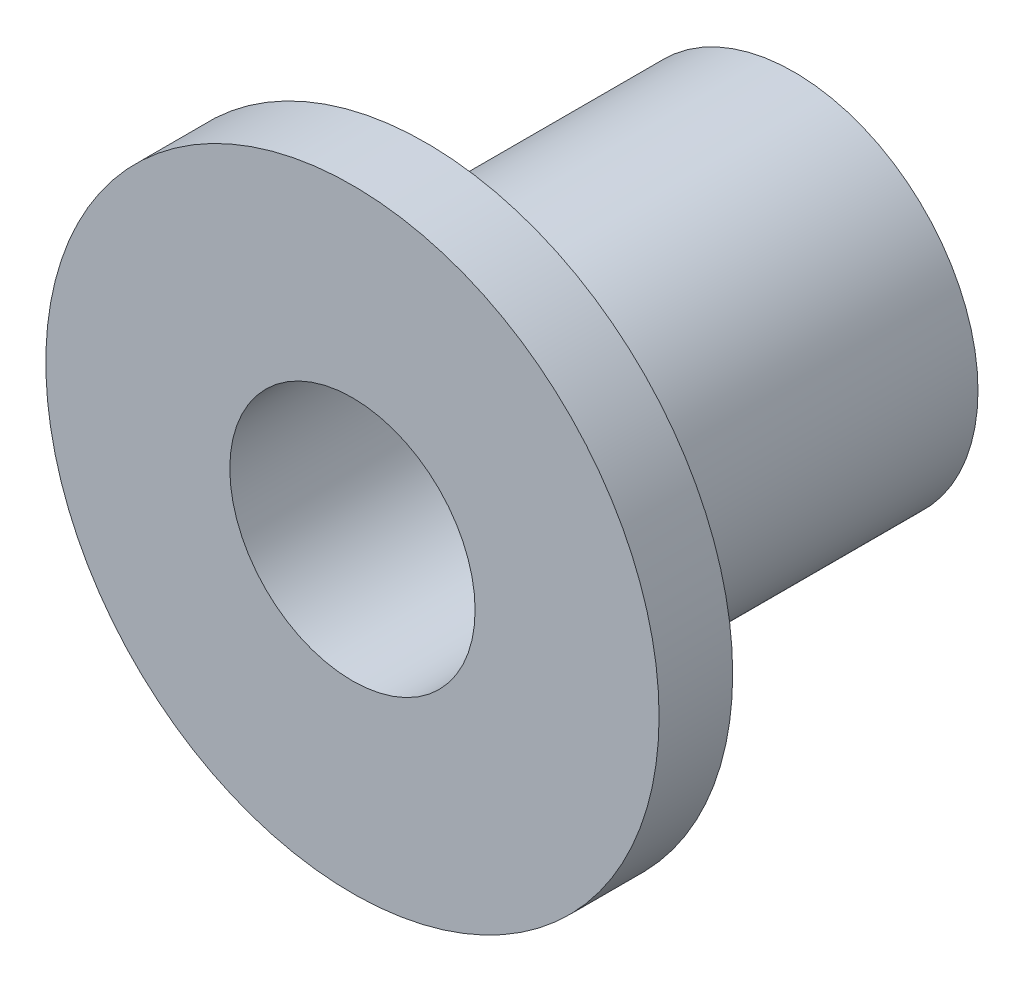
ISO-10303-21;
HEADER;
FILE_DESCRIPTION(('STEP AP214'),'2;1');
FILE_NAME('part.step','',(''),(''),'','','');
FILE_SCHEMA(('AUTOMOTIVE_DESIGN { 1 0 10303 214 1 1 1 1 }'));
ENDSEC;
DATA;
#1=APPLICATION_CONTEXT('core data for automotive mechanical design processes');
#2=APPLICATION_PROTOCOL_DEFINITION('international standard','automotive_design',2000,#1);
#3=PRODUCT_CONTEXT('',#1,'mechanical');
#4=PRODUCT('Part','Part','',(#3));
#5=PRODUCT_RELATED_PRODUCT_CATEGORY('part','',(#4));
#6=PRODUCT_DEFINITION_FORMATION('','',#4);
#7=PRODUCT_DEFINITION_CONTEXT('part definition',#1,'design');
#8=PRODUCT_DEFINITION('design','',#6,#7);
#9=PRODUCT_DEFINITION_SHAPE('','',#8);
#10=(LENGTH_UNIT() NAMED_UNIT(*) SI_UNIT(.MILLI.,.METRE.));
#11=(NAMED_UNIT(*) PLANE_ANGLE_UNIT() SI_UNIT($,.RADIAN.));
#12=(NAMED_UNIT(*) SI_UNIT($,.STERADIAN.) SOLID_ANGLE_UNIT());
#13=UNCERTAINTY_MEASURE_WITH_UNIT(LENGTH_MEASURE(1.E-05),#10,'distance_accuracy_value','');
#14=(GEOMETRIC_REPRESENTATION_CONTEXT(3) GLOBAL_UNCERTAINTY_ASSIGNED_CONTEXT((#13)) GLOBAL_UNIT_ASSIGNED_CONTEXT((#10,
#11,#12)) REPRESENTATION_CONTEXT('',''));
#15=CARTESIAN_POINT('',(0.,0.,0.));
#16=DIRECTION('',(0.,0.,1.));
#17=DIRECTION('',(1.,0.,0.));
#18=AXIS2_PLACEMENT_3D('',#15,#16,#17);
#19=CARTESIAN_POINT('',(0.,0.,3.));
#20=DIRECTION('',(0.,0.,-1.));
#21=DIRECTION('',(-1.,0.,0.));
#22=AXIS2_PLACEMENT_3D('',#19,#20,#21);
#23=CYLINDRICAL_SURFACE('',#22,12.5);
#24=CARTESIAN_POINT('',(0.,0.,3.));
#25=DIRECTION('',(0.,0.,1.));
#26=DIRECTION('',(1.,0.,0.));
#27=AXIS2_PLACEMENT_3D('',#24,#25,#26);
#28=CIRCLE('',#27,12.5);
#29=CARTESIAN_POINT('',(12.5,0.,3.));
#30=VERTEX_POINT('',#29);
#31=EDGE_CURVE('E38',#30,#30,#28,.T.);
#32=ORIENTED_EDGE('',*,*,#31,.F.);
#33=EDGE_LOOP('',(#32));
#34=FACE_BOUND('',#33,.T.);
#35=CARTESIAN_POINT('',(0.,0.,0.));
#36=DIRECTION('',(0.,0.,1.));
#37=DIRECTION('',(1.,0.,0.));
#38=AXIS2_PLACEMENT_3D('',#35,#36,#37);
#39=CIRCLE('',#38,12.5);
#40=CARTESIAN_POINT('',(12.5,0.,0.));
#41=VERTEX_POINT('',#40);
#42=EDGE_CURVE('E34',#41,#41,#39,.T.);
#43=ORIENTED_EDGE('',*,*,#42,.T.);
#44=EDGE_LOOP('',(#43));
#45=FACE_BOUND('',#44,.T.);
#46=ADVANCED_FACE('F31',(#34,#45),#23,.T.);
#47=CARTESIAN_POINT('',(0.,0.,3.));
#48=DIRECTION('',(0.,0.,-1.));
#49=DIRECTION('',(-1.,0.,0.));
#50=AXIS2_PLACEMENT_3D('',#47,#48,#49);
#51=CYLINDRICAL_SURFACE('',#50,5.);
#52=CARTESIAN_POINT('',(0.,0.,3.));
#53=DIRECTION('',(0.,0.,1.));
#54=DIRECTION('',(1.,0.,0.));
#55=AXIS2_PLACEMENT_3D('',#52,#53,#54);
#56=CIRCLE('',#55,5.);
#57=CARTESIAN_POINT('',(5.,0.,3.));
#58=VERTEX_POINT('',#57);
#59=EDGE_CURVE('E10',#58,#58,#56,.T.);
#60=ORIENTED_EDGE('',*,*,#59,.T.);
#61=EDGE_LOOP('',(#60));
#62=FACE_BOUND('',#61,.T.);
#63=CARTESIAN_POINT('',(0.,0.,-15.));
#64=DIRECTION('',(0.,0.,1.));
#65=DIRECTION('',(1.,0.,0.));
#66=AXIS2_PLACEMENT_3D('',#63,#64,#65);
#67=CIRCLE('',#66,5.);
#68=CARTESIAN_POINT('',(5.,0.,-15.));
#69=VERTEX_POINT('',#68);
#70=EDGE_CURVE('E47',#69,#69,#67,.T.);
#71=ORIENTED_EDGE('',*,*,#70,.F.);
#72=EDGE_LOOP('',(#71));
#73=FACE_BOUND('',#72,.T.);
#74=ADVANCED_FACE('F57',(#62,#73),#51,.F.);
#75=CARTESIAN_POINT('',(0.,0.,3.));
#76=DIRECTION('',(0.,0.,1.));
#77=DIRECTION('',(1.,0.,0.));
#78=AXIS2_PLACEMENT_3D('',#75,#76,#77);
#79=PLANE('',#78);
#80=ORIENTED_EDGE('',*,*,#31,.T.);
#81=EDGE_LOOP('',(#80));
#82=FACE_BOUND('',#81,.T.);
#83=ORIENTED_EDGE('',*,*,#59,.F.);
#84=EDGE_LOOP('',(#83));
#85=FACE_BOUND('',#84,.T.);
#86=ADVANCED_FACE('F59',(#82,#85),#79,.T.);
#87=CARTESIAN_POINT('',(0.,0.,0.));
#88=DIRECTION('',(0.,0.,1.));
#89=DIRECTION('',(1.,0.,0.));
#90=AXIS2_PLACEMENT_3D('',#87,#88,#89);
#91=PLANE('',#90);
#92=CARTESIAN_POINT('',(0.,0.,0.));
#93=DIRECTION('',(0.,0.,1.));
#94=DIRECTION('',(1.,0.,0.));
#95=AXIS2_PLACEMENT_3D('',#92,#93,#94);
#96=CIRCLE('',#95,7.5);
#97=CARTESIAN_POINT('',(7.5,0.,0.));
#98=VERTEX_POINT('',#97);
#99=EDGE_CURVE('E44',#98,#98,#96,.T.);
#100=ORIENTED_EDGE('',*,*,#99,.T.);
#101=EDGE_LOOP('',(#100));
#102=FACE_BOUND('',#101,.T.);
#103=ORIENTED_EDGE('',*,*,#42,.F.);
#104=EDGE_LOOP('',(#103));
#105=FACE_BOUND('',#104,.T.);
#106=ADVANCED_FACE('F64',(#102,#105),#91,.F.);
#107=CARTESIAN_POINT('',(0.,0.,-15.));
#108=DIRECTION('',(0.,0.,1.));
#109=DIRECTION('',(1.,0.,0.));
#110=AXIS2_PLACEMENT_3D('',#107,#108,#109);
#111=CYLINDRICAL_SURFACE('',#110,7.5);
#112=CARTESIAN_POINT('',(0.,0.,-15.));
#113=DIRECTION('',(0.,0.,1.));
#114=DIRECTION('',(1.,0.,0.));
#115=AXIS2_PLACEMENT_3D('',#112,#113,#114);
#116=CIRCLE('',#115,7.5);
#117=CARTESIAN_POINT('',(7.5,0.,-15.));
#118=VERTEX_POINT('',#117);
#119=EDGE_CURVE('E48',#118,#118,#116,.T.);
#120=ORIENTED_EDGE('',*,*,#119,.T.);
#121=EDGE_LOOP('',(#120));
#122=FACE_BOUND('',#121,.T.);
#123=ORIENTED_EDGE('',*,*,#99,.F.);
#124=EDGE_LOOP('',(#123));
#125=FACE_BOUND('',#124,.T.);
#126=ADVANCED_FACE('F70',(#122,#125),#111,.T.);
#127=CARTESIAN_POINT('',(0.,0.,-15.));
#128=DIRECTION('',(0.,0.,1.));
#129=DIRECTION('',(1.,0.,0.));
#130=AXIS2_PLACEMENT_3D('',#127,#128,#129);
#131=PLANE('',#130);
#132=ORIENTED_EDGE('',*,*,#70,.T.);
#133=EDGE_LOOP('',(#132));
#134=FACE_BOUND('',#133,.T.);
#135=ORIENTED_EDGE('',*,*,#119,.F.);
#136=EDGE_LOOP('',(#135));
#137=FACE_BOUND('',#136,.T.);
#138=ADVANCED_FACE('F54',(#134,#137),#131,.F.);
#139=CLOSED_SHELL('',(#46,#74,#86,#106,#126,#138));
#140=MANIFOLD_SOLID_BREP('B2',#139);
#141=ADVANCED_BREP_SHAPE_REPRESENTATION('',(#18,#140),#14);
#142=SHAPE_DEFINITION_REPRESENTATION(#9,#141);
ENDSEC;
END-ISO-10303-21;
